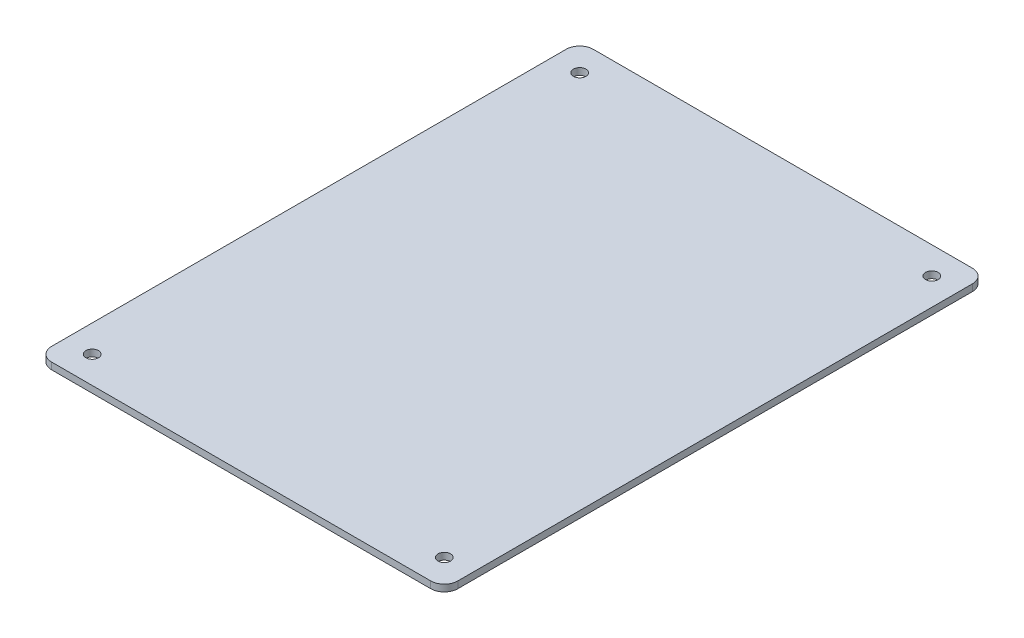
ISO-10303-21;
HEADER;
FILE_DESCRIPTION(('STEP AP214'),'2;1');
FILE_NAME('part.step','',(''),(''),'','','');
FILE_SCHEMA(('AUTOMOTIVE_DESIGN { 1 0 10303 214 1 1 1 1 }'));
ENDSEC;
DATA;
#1=APPLICATION_CONTEXT('core data for automotive mechanical design processes');
#2=APPLICATION_PROTOCOL_DEFINITION('international standard','automotive_design',2000,#1);
#3=PRODUCT_CONTEXT('',#1,'mechanical');
#4=PRODUCT('Part','Part','',(#3));
#5=PRODUCT_RELATED_PRODUCT_CATEGORY('part','',(#4));
#6=PRODUCT_DEFINITION_FORMATION('','',#4);
#7=PRODUCT_DEFINITION_CONTEXT('part definition',#1,'design');
#8=PRODUCT_DEFINITION('design','',#6,#7);
#9=PRODUCT_DEFINITION_SHAPE('','',#8);
#10=(LENGTH_UNIT() NAMED_UNIT(*) SI_UNIT(.MILLI.,.METRE.));
#11=(NAMED_UNIT(*) PLANE_ANGLE_UNIT() SI_UNIT($,.RADIAN.));
#12=(NAMED_UNIT(*) SI_UNIT($,.STERADIAN.) SOLID_ANGLE_UNIT());
#13=UNCERTAINTY_MEASURE_WITH_UNIT(LENGTH_MEASURE(1.E-05),#10,'distance_accuracy_value','');
#14=(GEOMETRIC_REPRESENTATION_CONTEXT(3) GLOBAL_UNCERTAINTY_ASSIGNED_CONTEXT((#13)) GLOBAL_UNIT_ASSIGNED_CONTEXT((#10,
#11,#12)) REPRESENTATION_CONTEXT('',''));
#15=CARTESIAN_POINT('',(0.,0.,0.));
#16=DIRECTION('',(0.,0.,1.));
#17=DIRECTION('',(1.,0.,0.));
#18=AXIS2_PLACEMENT_3D('',#15,#16,#17);
#19=CARTESIAN_POINT('',(47.625,1.5875,-63.5));
#20=DIRECTION('',(-1.,0.,0.));
#21=DIRECTION('',(0.,0.,1.));
#22=AXIS2_PLACEMENT_3D('',#19,#20,#21);
#23=PLANE('',#22);
#24=DIRECTION('',(0.,0.,-1.));
#25=VECTOR('',#24,1.);
#26=CARTESIAN_POINT('',(47.625,1.5875,-63.5));
#27=LINE('',#26,#25);
#28=CARTESIAN_POINT('',(47.625,1.5875,60.325));
#29=VERTEX_POINT('',#28);
#30=CARTESIAN_POINT('',(47.625,1.5875,-60.325));
#31=VERTEX_POINT('',#30);
#32=EDGE_CURVE('E124',#29,#31,#27,.T.);
#33=ORIENTED_EDGE('',*,*,#32,.F.);
#34=DIRECTION('',(0.,-1.,0.));
#35=VECTOR('',#34,1.);
#36=CARTESIAN_POINT('',(47.625,1.5875,60.325));
#37=LINE('',#36,#35);
#38=CARTESIAN_POINT('',(47.625,0.,60.325));
#39=VERTEX_POINT('',#38);
#40=EDGE_CURVE('E163',#29,#39,#37,.T.);
#41=ORIENTED_EDGE('',*,*,#40,.T.);
#42=DIRECTION('',(0.,0.,-1.));
#43=VECTOR('',#42,1.);
#44=CARTESIAN_POINT('',(47.625,0.,-63.5));
#45=LINE('',#44,#43);
#46=CARTESIAN_POINT('',(47.625,0.,-60.325));
#47=VERTEX_POINT('',#46);
#48=EDGE_CURVE('E169',#39,#47,#45,.T.);
#49=ORIENTED_EDGE('',*,*,#48,.T.);
#50=DIRECTION('',(0.,-1.,0.));
#51=VECTOR('',#50,1.);
#52=CARTESIAN_POINT('',(47.625,1.5875,-60.325));
#53=LINE('',#52,#51);
#54=EDGE_CURVE('E161',#47,#31,#53,.F.);
#55=ORIENTED_EDGE('',*,*,#54,.T.);
#56=EDGE_LOOP('',(#33,#41,#49,#55));
#57=FACE_BOUND('',#56,.T.);
#58=ADVANCED_FACE('F32',(#57),#23,.F.);
#59=CARTESIAN_POINT('',(-47.625,1.5875,-63.5));
#60=DIRECTION('',(0.,0.,1.));
#61=DIRECTION('',(1.,0.,0.));
#62=AXIS2_PLACEMENT_3D('',#59,#60,#61);
#63=PLANE('',#62);
#64=DIRECTION('',(-1.,0.,0.));
#65=VECTOR('',#64,1.);
#66=CARTESIAN_POINT('',(-47.625,1.5875,-63.5));
#67=LINE('',#66,#65);
#68=CARTESIAN_POINT('',(44.45,1.5875,-63.5));
#69=VERTEX_POINT('',#68);
#70=CARTESIAN_POINT('',(-44.45,1.5875,-63.5));
#71=VERTEX_POINT('',#70);
#72=EDGE_CURVE('E127',#69,#71,#67,.T.);
#73=ORIENTED_EDGE('',*,*,#72,.F.);
#74=DIRECTION('',(0.,-1.,0.));
#75=VECTOR('',#74,1.);
#76=CARTESIAN_POINT('',(44.45,1.5875,-63.5));
#77=LINE('',#76,#75);
#78=CARTESIAN_POINT('',(44.45,0.,-63.5));
#79=VERTEX_POINT('',#78);
#80=EDGE_CURVE('E11',#69,#79,#77,.T.);
#81=ORIENTED_EDGE('',*,*,#80,.T.);
#82=DIRECTION('',(-1.,0.,0.));
#83=VECTOR('',#82,1.);
#84=CARTESIAN_POINT('',(-47.625,0.,-63.5));
#85=LINE('',#84,#83);
#86=CARTESIAN_POINT('',(-44.45,0.,-63.5));
#87=VERTEX_POINT('',#86);
#88=EDGE_CURVE('E129',#79,#87,#85,.T.);
#89=ORIENTED_EDGE('',*,*,#88,.T.);
#90=DIRECTION('',(0.,-1.,0.));
#91=VECTOR('',#90,1.);
#92=CARTESIAN_POINT('',(-44.45,1.5875,-63.5));
#93=LINE('',#92,#91);
#94=EDGE_CURVE('E40',#87,#71,#93,.F.);
#95=ORIENTED_EDGE('',*,*,#94,.T.);
#96=EDGE_LOOP('',(#73,#81,#89,#95));
#97=FACE_BOUND('',#96,.T.);
#98=ADVANCED_FACE('F211',(#97),#63,.F.);
#99=CARTESIAN_POINT('',(-47.625,1.5875,-63.5));
#100=DIRECTION('',(1.,0.,0.));
#101=DIRECTION('',(0.,0.,-1.));
#102=AXIS2_PLACEMENT_3D('',#99,#100,#101);
#103=PLANE('',#102);
#104=DIRECTION('',(0.,0.,1.));
#105=VECTOR('',#104,1.);
#106=CARTESIAN_POINT('',(-47.625,0.,-63.5));
#107=LINE('',#106,#105);
#108=CARTESIAN_POINT('',(-47.625,0.,-60.325));
#109=VERTEX_POINT('',#108);
#110=CARTESIAN_POINT('',(-47.625,0.,60.325));
#111=VERTEX_POINT('',#110);
#112=EDGE_CURVE('E125',#109,#111,#107,.T.);
#113=ORIENTED_EDGE('',*,*,#112,.T.);
#114=DIRECTION('',(0.,-1.,0.));
#115=VECTOR('',#114,1.);
#116=CARTESIAN_POINT('',(-47.625,1.5875,60.325));
#117=LINE('',#116,#115);
#118=CARTESIAN_POINT('',(-47.625,1.5875,60.325));
#119=VERTEX_POINT('',#118);
#120=EDGE_CURVE('E103',#111,#119,#117,.F.);
#121=ORIENTED_EDGE('',*,*,#120,.T.);
#122=DIRECTION('',(0.,0.,1.));
#123=VECTOR('',#122,1.);
#124=CARTESIAN_POINT('',(-47.625,1.5875,-63.5));
#125=LINE('',#124,#123);
#126=CARTESIAN_POINT('',(-47.625,1.5875,-60.325));
#127=VERTEX_POINT('',#126);
#128=EDGE_CURVE('E180',#127,#119,#125,.T.);
#129=ORIENTED_EDGE('',*,*,#128,.F.);
#130=DIRECTION('',(0.,-1.,0.));
#131=VECTOR('',#130,1.);
#132=CARTESIAN_POINT('',(-47.625,1.5875,-60.325));
#133=LINE('',#132,#131);
#134=EDGE_CURVE('E108',#127,#109,#133,.T.);
#135=ORIENTED_EDGE('',*,*,#134,.T.);
#136=EDGE_LOOP('',(#113,#121,#129,#135));
#137=FACE_BOUND('',#136,.T.);
#138=ADVANCED_FACE('F209',(#137),#103,.F.);
#139=CARTESIAN_POINT('',(-47.625,1.5875,63.5));
#140=DIRECTION('',(0.,0.,-1.));
#141=DIRECTION('',(-1.,0.,0.));
#142=AXIS2_PLACEMENT_3D('',#139,#140,#141);
#143=PLANE('',#142);
#144=DIRECTION('',(1.,0.,0.));
#145=VECTOR('',#144,1.);
#146=CARTESIAN_POINT('',(-47.625,1.5875,63.5));
#147=LINE('',#146,#145);
#148=CARTESIAN_POINT('',(-44.45,1.5875,63.5));
#149=VERTEX_POINT('',#148);
#150=CARTESIAN_POINT('',(44.45,1.5875,63.5));
#151=VERTEX_POINT('',#150);
#152=EDGE_CURVE('E118',#149,#151,#147,.T.);
#153=ORIENTED_EDGE('',*,*,#152,.F.);
#154=DIRECTION('',(0.,-1.,0.));
#155=VECTOR('',#154,1.);
#156=CARTESIAN_POINT('',(-44.45,1.5875,63.5));
#157=LINE('',#156,#155);
#158=CARTESIAN_POINT('',(-44.45,0.,63.5));
#159=VERTEX_POINT('',#158);
#160=EDGE_CURVE('E102',#149,#159,#157,.T.);
#161=ORIENTED_EDGE('',*,*,#160,.T.);
#162=DIRECTION('',(1.,0.,0.));
#163=VECTOR('',#162,1.);
#164=CARTESIAN_POINT('',(-47.625,0.,63.5));
#165=LINE('',#164,#163);
#166=CARTESIAN_POINT('',(44.45,0.,63.5));
#167=VERTEX_POINT('',#166);
#168=EDGE_CURVE('E115',#159,#167,#165,.T.);
#169=ORIENTED_EDGE('',*,*,#168,.T.);
#170=DIRECTION('',(0.,-1.,0.));
#171=VECTOR('',#170,1.);
#172=CARTESIAN_POINT('',(44.45,1.5875,63.5));
#173=LINE('',#172,#171);
#174=EDGE_CURVE('E120',#167,#151,#173,.F.);
#175=ORIENTED_EDGE('',*,*,#174,.T.);
#176=EDGE_LOOP('',(#153,#161,#169,#175));
#177=FACE_BOUND('',#176,.T.);
#178=ADVANCED_FACE('F114',(#177),#143,.F.);
#179=CARTESIAN_POINT('',(47.625,1.5875,63.5));
#180=DIRECTION('',(0.,1.,0.));
#181=DIRECTION('',(0.,0.,1.));
#182=AXIS2_PLACEMENT_3D('',#179,#180,#181);
#183=PLANE('',#182);
#184=CARTESIAN_POINT('',(-41.275,1.5875,-57.15));
#185=DIRECTION('',(0.,1.,0.));
#186=DIRECTION('',(0.,0.,1.));
#187=AXIS2_PLACEMENT_3D('',#184,#185,#186);
#188=CIRCLE('',#187,1.4732);
#189=CARTESIAN_POINT('',(-41.275,1.5875,-55.6768));
#190=VERTEX_POINT('',#189);
#191=EDGE_CURVE('E145',#190,#190,#188,.T.);
#192=ORIENTED_EDGE('',*,*,#191,.F.);
#193=EDGE_LOOP('',(#192));
#194=FACE_BOUND('',#193,.T.);
#195=CARTESIAN_POINT('',(41.275,1.5875,-57.15));
#196=DIRECTION('',(0.,1.,0.));
#197=DIRECTION('',(0.,0.,1.));
#198=AXIS2_PLACEMENT_3D('',#195,#196,#197);
#199=CIRCLE('',#198,1.4732);
#200=CARTESIAN_POINT('',(41.275,1.5875,-55.6768));
#201=VERTEX_POINT('',#200);
#202=EDGE_CURVE('E141',#201,#201,#199,.T.);
#203=ORIENTED_EDGE('',*,*,#202,.F.);
#204=EDGE_LOOP('',(#203));
#205=FACE_BOUND('',#204,.T.);
#206=CARTESIAN_POINT('',(41.275,1.5875,57.15));
#207=DIRECTION('',(0.,1.,0.));
#208=DIRECTION('',(0.,0.,1.));
#209=AXIS2_PLACEMENT_3D('',#206,#207,#208);
#210=CIRCLE('',#209,1.4732);
#211=CARTESIAN_POINT('',(41.275,1.5875,58.6232));
#212=VERTEX_POINT('',#211);
#213=EDGE_CURVE('E137',#212,#212,#210,.T.);
#214=ORIENTED_EDGE('',*,*,#213,.F.);
#215=EDGE_LOOP('',(#214));
#216=FACE_BOUND('',#215,.T.);
#217=CARTESIAN_POINT('',(-41.275,1.5875,57.15));
#218=DIRECTION('',(0.,1.,0.));
#219=DIRECTION('',(0.,0.,1.));
#220=AXIS2_PLACEMENT_3D('',#217,#218,#219);
#221=CIRCLE('',#220,1.4732);
#222=CARTESIAN_POINT('',(-41.275,1.5875,58.6232));
#223=VERTEX_POINT('',#222);
#224=EDGE_CURVE('E136',#223,#223,#221,.T.);
#225=ORIENTED_EDGE('',*,*,#224,.F.);
#226=EDGE_LOOP('',(#225));
#227=FACE_BOUND('',#226,.T.);
#228=ORIENTED_EDGE('',*,*,#128,.T.);
#229=CARTESIAN_POINT('',(-44.45,1.5875,60.325));
#230=DIRECTION('',(0.,1.,0.));
#231=DIRECTION('',(0.,0.,1.));
#232=AXIS2_PLACEMENT_3D('',#229,#230,#231);
#233=CIRCLE('',#232,3.175);
#234=EDGE_CURVE('E159',#119,#149,#233,.T.);
#235=ORIENTED_EDGE('',*,*,#234,.T.);
#236=ORIENTED_EDGE('',*,*,#152,.T.);
#237=CARTESIAN_POINT('',(44.45,1.5875,60.325));
#238=DIRECTION('',(0.,1.,0.));
#239=DIRECTION('',(0.,0.,1.));
#240=AXIS2_PLACEMENT_3D('',#237,#238,#239);
#241=CIRCLE('',#240,3.175);
#242=EDGE_CURVE('E157',#151,#29,#241,.T.);
#243=ORIENTED_EDGE('',*,*,#242,.T.);
#244=ORIENTED_EDGE('',*,*,#32,.T.);
#245=CARTESIAN_POINT('',(44.45,1.5875,-60.325));
#246=DIRECTION('',(0.,1.,0.));
#247=DIRECTION('',(0.,0.,1.));
#248=AXIS2_PLACEMENT_3D('',#245,#246,#247);
#249=CIRCLE('',#248,3.175);
#250=EDGE_CURVE('E53',#31,#69,#249,.T.);
#251=ORIENTED_EDGE('',*,*,#250,.T.);
#252=ORIENTED_EDGE('',*,*,#72,.T.);
#253=CARTESIAN_POINT('',(-44.45,1.5875,-60.325));
#254=DIRECTION('',(0.,1.,0.));
#255=DIRECTION('',(0.,0.,1.));
#256=AXIS2_PLACEMENT_3D('',#253,#254,#255);
#257=CIRCLE('',#256,3.175);
#258=EDGE_CURVE('E154',#71,#127,#257,.T.);
#259=ORIENTED_EDGE('',*,*,#258,.T.);
#260=EDGE_LOOP('',(#228,#235,#236,#243,#244,#251,#252,#259));
#261=FACE_BOUND('',#260,.T.);
#262=ADVANCED_FACE('F196',(#194,#205,#216,#227,#261),#183,.T.);
#263=CARTESIAN_POINT('',(47.625,0.,63.5));
#264=DIRECTION('',(0.,1.,0.));
#265=DIRECTION('',(0.,0.,1.));
#266=AXIS2_PLACEMENT_3D('',#263,#264,#265);
#267=PLANE('',#266);
#268=CARTESIAN_POINT('',(-41.275,0.,-57.15));
#269=DIRECTION('',(0.,1.,0.));
#270=DIRECTION('',(0.,0.,1.));
#271=AXIS2_PLACEMENT_3D('',#268,#269,#270);
#272=CIRCLE('',#271,1.4732);
#273=CARTESIAN_POINT('',(-41.275,0.,-55.6768));
#274=VERTEX_POINT('',#273);
#275=EDGE_CURVE('E142',#274,#274,#272,.T.);
#276=ORIENTED_EDGE('',*,*,#275,.T.);
#277=EDGE_LOOP('',(#276));
#278=FACE_BOUND('',#277,.T.);
#279=CARTESIAN_POINT('',(41.275,0.,-57.15));
#280=DIRECTION('',(0.,1.,0.));
#281=DIRECTION('',(0.,0.,1.));
#282=AXIS2_PLACEMENT_3D('',#279,#280,#281);
#283=CIRCLE('',#282,1.4732);
#284=CARTESIAN_POINT('',(41.275,0.,-55.6768));
#285=VERTEX_POINT('',#284);
#286=EDGE_CURVE('E138',#285,#285,#283,.T.);
#287=ORIENTED_EDGE('',*,*,#286,.T.);
#288=EDGE_LOOP('',(#287));
#289=FACE_BOUND('',#288,.T.);
#290=CARTESIAN_POINT('',(41.275,0.,57.15));
#291=DIRECTION('',(0.,1.,0.));
#292=DIRECTION('',(0.,0.,1.));
#293=AXIS2_PLACEMENT_3D('',#290,#291,#292);
#294=CIRCLE('',#293,1.4732);
#295=CARTESIAN_POINT('',(41.275,0.,58.6232));
#296=VERTEX_POINT('',#295);
#297=EDGE_CURVE('E133',#296,#296,#294,.T.);
#298=ORIENTED_EDGE('',*,*,#297,.T.);
#299=EDGE_LOOP('',(#298));
#300=FACE_BOUND('',#299,.T.);
#301=CARTESIAN_POINT('',(-41.275,0.,57.15));
#302=DIRECTION('',(0.,1.,0.));
#303=DIRECTION('',(0.,0.,1.));
#304=AXIS2_PLACEMENT_3D('',#301,#302,#303);
#305=CIRCLE('',#304,1.4732);
#306=CARTESIAN_POINT('',(-41.275,0.,58.6232));
#307=VERTEX_POINT('',#306);
#308=EDGE_CURVE('E174',#307,#307,#305,.T.);
#309=ORIENTED_EDGE('',*,*,#308,.T.);
#310=EDGE_LOOP('',(#309));
#311=FACE_BOUND('',#310,.T.);
#312=ORIENTED_EDGE('',*,*,#168,.F.);
#313=CARTESIAN_POINT('',(-44.45,0.,60.325));
#314=DIRECTION('',(0.,1.,0.));
#315=DIRECTION('',(0.,0.,1.));
#316=AXIS2_PLACEMENT_3D('',#313,#314,#315);
#317=CIRCLE('',#316,3.175);
#318=EDGE_CURVE('E98',#159,#111,#317,.F.);
#319=ORIENTED_EDGE('',*,*,#318,.T.);
#320=ORIENTED_EDGE('',*,*,#112,.F.);
#321=CARTESIAN_POINT('',(-44.45,0.,-60.325));
#322=DIRECTION('',(0.,1.,0.));
#323=DIRECTION('',(0.,0.,1.));
#324=AXIS2_PLACEMENT_3D('',#321,#322,#323);
#325=CIRCLE('',#324,3.175);
#326=EDGE_CURVE('E119',#109,#87,#325,.F.);
#327=ORIENTED_EDGE('',*,*,#326,.T.);
#328=ORIENTED_EDGE('',*,*,#88,.F.);
#329=CARTESIAN_POINT('',(44.45,0.,-60.325));
#330=DIRECTION('',(0.,1.,0.));
#331=DIRECTION('',(0.,0.,1.));
#332=AXIS2_PLACEMENT_3D('',#329,#330,#331);
#333=CIRCLE('',#332,3.175);
#334=EDGE_CURVE('E148',#79,#47,#333,.F.);
#335=ORIENTED_EDGE('',*,*,#334,.T.);
#336=ORIENTED_EDGE('',*,*,#48,.F.);
#337=CARTESIAN_POINT('',(44.45,0.,60.325));
#338=DIRECTION('',(0.,1.,0.));
#339=DIRECTION('',(0.,0.,1.));
#340=AXIS2_PLACEMENT_3D('',#337,#338,#339);
#341=CIRCLE('',#340,3.175);
#342=EDGE_CURVE('E109',#39,#167,#341,.F.);
#343=ORIENTED_EDGE('',*,*,#342,.T.);
#344=EDGE_LOOP('',(#312,#319,#320,#327,#328,#335,#336,#343));
#345=FACE_BOUND('',#344,.T.);
#346=ADVANCED_FACE('F122',(#278,#289,#300,#311,#345),#267,.F.);
#347=CARTESIAN_POINT('',(-41.275,1.5875,57.15));
#348=DIRECTION('',(0.,1.,0.));
#349=DIRECTION('',(0.,0.,1.));
#350=AXIS2_PLACEMENT_3D('',#347,#348,#349);
#351=CYLINDRICAL_SURFACE('',#350,1.4732);
#352=ORIENTED_EDGE('',*,*,#224,.T.);
#353=EDGE_LOOP('',(#352));
#354=FACE_BOUND('',#353,.T.);
#355=ORIENTED_EDGE('',*,*,#308,.F.);
#356=EDGE_LOOP('',(#355));
#357=FACE_BOUND('',#356,.T.);
#358=ADVANCED_FACE('F235',(#354,#357),#351,.F.);
#359=CARTESIAN_POINT('',(41.275,1.5875,57.15));
#360=DIRECTION('',(0.,1.,0.));
#361=DIRECTION('',(0.,0.,1.));
#362=AXIS2_PLACEMENT_3D('',#359,#360,#361);
#363=CYLINDRICAL_SURFACE('',#362,1.4732);
#364=ORIENTED_EDGE('',*,*,#213,.T.);
#365=EDGE_LOOP('',(#364));
#366=FACE_BOUND('',#365,.T.);
#367=ORIENTED_EDGE('',*,*,#297,.F.);
#368=EDGE_LOOP('',(#367));
#369=FACE_BOUND('',#368,.T.);
#370=ADVANCED_FACE('F240',(#366,#369),#363,.F.);
#371=CARTESIAN_POINT('',(41.275,1.5875,-57.15));
#372=DIRECTION('',(0.,1.,0.));
#373=DIRECTION('',(0.,0.,1.));
#374=AXIS2_PLACEMENT_3D('',#371,#372,#373);
#375=CYLINDRICAL_SURFACE('',#374,1.4732);
#376=ORIENTED_EDGE('',*,*,#202,.T.);
#377=EDGE_LOOP('',(#376));
#378=FACE_BOUND('',#377,.T.);
#379=ORIENTED_EDGE('',*,*,#286,.F.);
#380=EDGE_LOOP('',(#379));
#381=FACE_BOUND('',#380,.T.);
#382=ADVANCED_FACE('F244',(#378,#381),#375,.F.);
#383=CARTESIAN_POINT('',(-41.275,1.5875,-57.15));
#384=DIRECTION('',(0.,1.,0.));
#385=DIRECTION('',(0.,0.,1.));
#386=AXIS2_PLACEMENT_3D('',#383,#384,#385);
#387=CYLINDRICAL_SURFACE('',#386,1.4732);
#388=ORIENTED_EDGE('',*,*,#191,.T.);
#389=EDGE_LOOP('',(#388));
#390=FACE_BOUND('',#389,.T.);
#391=ORIENTED_EDGE('',*,*,#275,.F.);
#392=EDGE_LOOP('',(#391));
#393=FACE_BOUND('',#392,.T.);
#394=ADVANCED_FACE('F193',(#390,#393),#387,.F.);
#395=CARTESIAN_POINT('',(-44.45,1.5875,60.325));
#396=DIRECTION('',(0.,-1.,0.));
#397=DIRECTION('',(0.,0.,-1.));
#398=AXIS2_PLACEMENT_3D('',#395,#396,#397);
#399=CYLINDRICAL_SURFACE('',#398,3.175);
#400=ORIENTED_EDGE('',*,*,#234,.F.);
#401=ORIENTED_EDGE('',*,*,#120,.F.);
#402=ORIENTED_EDGE('',*,*,#318,.F.);
#403=ORIENTED_EDGE('',*,*,#160,.F.);
#404=EDGE_LOOP('',(#400,#401,#402,#403));
#405=FACE_BOUND('',#404,.T.);
#406=ADVANCED_FACE('F101',(#405),#399,.T.);
#407=CARTESIAN_POINT('',(44.45,1.5875,60.325));
#408=DIRECTION('',(0.,-1.,0.));
#409=DIRECTION('',(0.,0.,-1.));
#410=AXIS2_PLACEMENT_3D('',#407,#408,#409);
#411=CYLINDRICAL_SURFACE('',#410,3.175);
#412=ORIENTED_EDGE('',*,*,#242,.F.);
#413=ORIENTED_EDGE('',*,*,#174,.F.);
#414=ORIENTED_EDGE('',*,*,#342,.F.);
#415=ORIENTED_EDGE('',*,*,#40,.F.);
#416=EDGE_LOOP('',(#412,#413,#414,#415));
#417=FACE_BOUND('',#416,.T.);
#418=ADVANCED_FACE('F215',(#417),#411,.T.);
#419=CARTESIAN_POINT('',(44.45,1.5875,-60.325));
#420=DIRECTION('',(0.,-1.,0.));
#421=DIRECTION('',(0.,0.,-1.));
#422=AXIS2_PLACEMENT_3D('',#419,#420,#421);
#423=CYLINDRICAL_SURFACE('',#422,3.175);
#424=ORIENTED_EDGE('',*,*,#250,.F.);
#425=ORIENTED_EDGE('',*,*,#54,.F.);
#426=ORIENTED_EDGE('',*,*,#334,.F.);
#427=ORIENTED_EDGE('',*,*,#80,.F.);
#428=EDGE_LOOP('',(#424,#425,#426,#427));
#429=FACE_BOUND('',#428,.T.);
#430=ADVANCED_FACE('F214',(#429),#423,.T.);
#431=CARTESIAN_POINT('',(-44.45,1.5875,-60.325));
#432=DIRECTION('',(0.,-1.,0.));
#433=DIRECTION('',(0.,0.,-1.));
#434=AXIS2_PLACEMENT_3D('',#431,#432,#433);
#435=CYLINDRICAL_SURFACE('',#434,3.175);
#436=ORIENTED_EDGE('',*,*,#258,.F.);
#437=ORIENTED_EDGE('',*,*,#94,.F.);
#438=ORIENTED_EDGE('',*,*,#326,.F.);
#439=ORIENTED_EDGE('',*,*,#134,.F.);
#440=EDGE_LOOP('',(#436,#437,#438,#439));
#441=FACE_BOUND('',#440,.T.);
#442=ADVANCED_FACE('F34',(#441),#435,.T.);
#443=CLOSED_SHELL('',(#58,#98,#138,#178,#262,#346,#358,#370,#382,#394,#406,#418,#430,#442));
#444=MANIFOLD_SOLID_BREP('B2',#443);
#445=ADVANCED_BREP_SHAPE_REPRESENTATION('',(#18,#444),#14);
#446=SHAPE_DEFINITION_REPRESENTATION(#9,#445);
ENDSEC;
END-ISO-10303-21;
